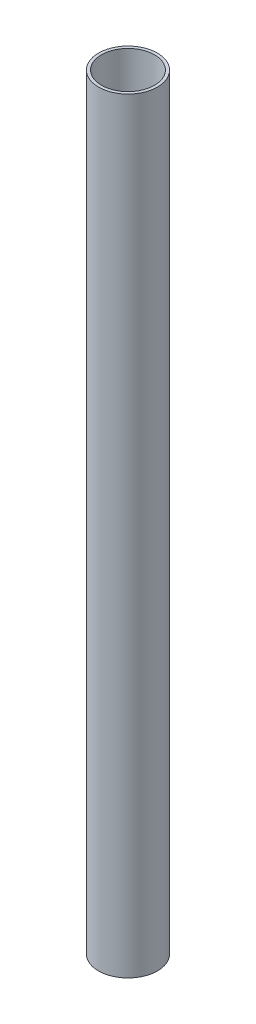
ISO-10303-21;
HEADER;
FILE_DESCRIPTION(('STEP AP214'),'2;1');
FILE_NAME('part.step','',(''),(''),'','','');
FILE_SCHEMA(('AUTOMOTIVE_DESIGN { 1 0 10303 214 1 1 1 1 }'));
ENDSEC;
DATA;
#1=APPLICATION_CONTEXT('core data for automotive mechanical design processes');
#2=APPLICATION_PROTOCOL_DEFINITION('international standard','automotive_design',2000,#1);
#3=PRODUCT_CONTEXT('',#1,'mechanical');
#4=PRODUCT('Part','Part','',(#3));
#5=PRODUCT_RELATED_PRODUCT_CATEGORY('part','',(#4));
#6=PRODUCT_DEFINITION_FORMATION('','',#4);
#7=PRODUCT_DEFINITION_CONTEXT('part definition',#1,'design');
#8=PRODUCT_DEFINITION('design','',#6,#7);
#9=PRODUCT_DEFINITION_SHAPE('','',#8);
#10=(LENGTH_UNIT() NAMED_UNIT(*) SI_UNIT(.MILLI.,.METRE.));
#11=(NAMED_UNIT(*) PLANE_ANGLE_UNIT() SI_UNIT($,.RADIAN.));
#12=(NAMED_UNIT(*) SI_UNIT($,.STERADIAN.) SOLID_ANGLE_UNIT());
#13=UNCERTAINTY_MEASURE_WITH_UNIT(LENGTH_MEASURE(1.E-05),#10,'distance_accuracy_value','');
#14=(GEOMETRIC_REPRESENTATION_CONTEXT(3) GLOBAL_UNCERTAINTY_ASSIGNED_CONTEXT((#13)) GLOBAL_UNIT_ASSIGNED_CONTEXT((#10,
#11,#12)) REPRESENTATION_CONTEXT('',''));
#15=CARTESIAN_POINT('',(0.,0.,0.));
#16=DIRECTION('',(0.,0.,1.));
#17=DIRECTION('',(1.,0.,0.));
#18=AXIS2_PLACEMENT_3D('',#15,#16,#17);
#19=CARTESIAN_POINT('',(0.,130.,0.));
#20=DIRECTION('',(0.,1.,0.));
#21=DIRECTION('',(0.,0.,1.));
#22=AXIS2_PLACEMENT_3D('',#19,#20,#21);
#23=PLANE('',#22);
#24=CARTESIAN_POINT('',(0.,130.,0.));
#25=DIRECTION('',(0.,1.,0.));
#26=DIRECTION('',(0.,0.,1.));
#27=AXIS2_PLACEMENT_3D('',#24,#25,#26);
#28=CIRCLE('',#27,10.);
#29=CARTESIAN_POINT('',(0.,130.,10.));
#30=VERTEX_POINT('',#29);
#31=EDGE_CURVE('E11',#30,#30,#28,.T.);
#32=ORIENTED_EDGE('',*,*,#31,.T.);
#33=EDGE_LOOP('',(#32));
#34=FACE_BOUND('',#33,.T.);
#35=CARTESIAN_POINT('',(0.,130.,0.));
#36=DIRECTION('',(0.,1.,0.));
#37=DIRECTION('',(1.,0.,0.));
#38=AXIS2_PLACEMENT_3D('',#35,#36,#37);
#39=CIRCLE('',#38,9.);
#40=CARTESIAN_POINT('',(9.,130.,0.));
#41=VERTEX_POINT('',#40);
#42=EDGE_CURVE('E50',#41,#41,#39,.T.);
#43=ORIENTED_EDGE('',*,*,#42,.F.);
#44=EDGE_LOOP('',(#43));
#45=FACE_BOUND('',#44,.T.);
#46=ADVANCED_FACE('F39',(#34,#45),#23,.T.);
#47=CARTESIAN_POINT('',(0.,-130.,0.));
#48=DIRECTION('',(0.,1.,0.));
#49=DIRECTION('',(0.,0.,1.));
#50=AXIS2_PLACEMENT_3D('',#47,#48,#49);
#51=PLANE('',#50);
#52=CARTESIAN_POINT('',(0.,-130.,0.));
#53=DIRECTION('',(0.,1.,0.));
#54=DIRECTION('',(0.,0.,1.));
#55=AXIS2_PLACEMENT_3D('',#52,#53,#54);
#56=CIRCLE('',#55,10.);
#57=CARTESIAN_POINT('',(0.,-130.,10.));
#58=VERTEX_POINT('',#57);
#59=EDGE_CURVE('E43',#58,#58,#56,.T.);
#60=ORIENTED_EDGE('',*,*,#59,.F.);
#61=EDGE_LOOP('',(#60));
#62=FACE_BOUND('',#61,.T.);
#63=CARTESIAN_POINT('',(0.,-130.,0.));
#64=DIRECTION('',(0.,1.,0.));
#65=DIRECTION('',(1.,0.,0.));
#66=AXIS2_PLACEMENT_3D('',#63,#64,#65);
#67=CIRCLE('',#66,9.);
#68=CARTESIAN_POINT('',(9.,-130.,0.));
#69=VERTEX_POINT('',#68);
#70=EDGE_CURVE('E52',#69,#69,#67,.T.);
#71=ORIENTED_EDGE('',*,*,#70,.T.);
#72=EDGE_LOOP('',(#71));
#73=FACE_BOUND('',#72,.T.);
#74=ADVANCED_FACE('F62',(#62,#73),#51,.F.);
#75=CARTESIAN_POINT('',(0.,130.,0.));
#76=DIRECTION('',(0.,-1.,0.));
#77=DIRECTION('',(0.,0.,-1.));
#78=AXIS2_PLACEMENT_3D('',#75,#76,#77);
#79=CYLINDRICAL_SURFACE('',#78,10.);
#80=ORIENTED_EDGE('',*,*,#31,.F.);
#81=EDGE_LOOP('',(#80));
#82=FACE_BOUND('',#81,.T.);
#83=ORIENTED_EDGE('',*,*,#59,.T.);
#84=EDGE_LOOP('',(#83));
#85=FACE_BOUND('',#84,.T.);
#86=ADVANCED_FACE('F41',(#82,#85),#79,.T.);
#87=CARTESIAN_POINT('',(0.,130.,0.));
#88=DIRECTION('',(0.,-1.,0.));
#89=DIRECTION('',(0.,0.,-1.));
#90=AXIS2_PLACEMENT_3D('',#87,#88,#89);
#91=CYLINDRICAL_SURFACE('',#90,9.);
#92=ORIENTED_EDGE('',*,*,#42,.T.);
#93=EDGE_LOOP('',(#92));
#94=FACE_BOUND('',#93,.T.);
#95=ORIENTED_EDGE('',*,*,#70,.F.);
#96=EDGE_LOOP('',(#95));
#97=FACE_BOUND('',#96,.T.);
#98=ADVANCED_FACE('F58',(#94,#97),#91,.F.);
#99=CLOSED_SHELL('',(#46,#74,#86,#98));
#100=MANIFOLD_SOLID_BREP('B2',#99);
#101=ADVANCED_BREP_SHAPE_REPRESENTATION('',(#18,#100),#14);
#102=SHAPE_DEFINITION_REPRESENTATION(#9,#101);
ENDSEC;
END-ISO-10303-21;
